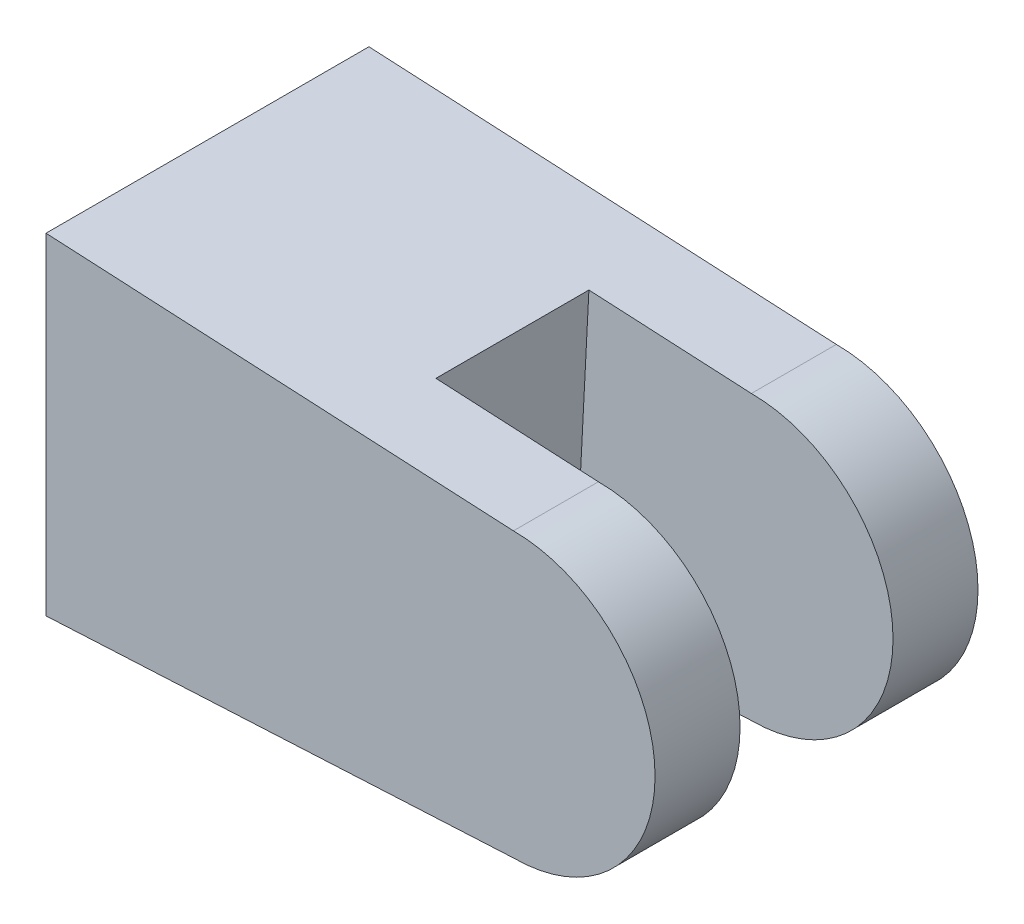
ISO-10303-21;
HEADER;
FILE_DESCRIPTION(('STEP AP214'),'2;1');
FILE_NAME('part.step','',(''),(''),'','','');
FILE_SCHEMA(('AUTOMOTIVE_DESIGN { 1 0 10303 214 1 1 1 1 }'));
ENDSEC;
DATA;
#1=APPLICATION_CONTEXT('core data for automotive mechanical design processes');
#2=APPLICATION_PROTOCOL_DEFINITION('international standard','automotive_design',2000,#1);
#3=PRODUCT_CONTEXT('',#1,'mechanical');
#4=PRODUCT('Part','Part','',(#3));
#5=PRODUCT_RELATED_PRODUCT_CATEGORY('part','',(#4));
#6=PRODUCT_DEFINITION_FORMATION('','',#4);
#7=PRODUCT_DEFINITION_CONTEXT('part definition',#1,'design');
#8=PRODUCT_DEFINITION('design','',#6,#7);
#9=PRODUCT_DEFINITION_SHAPE('','',#8);
#10=(LENGTH_UNIT() NAMED_UNIT(*) SI_UNIT(.MILLI.,.METRE.));
#11=(NAMED_UNIT(*) PLANE_ANGLE_UNIT() SI_UNIT($,.RADIAN.));
#12=(NAMED_UNIT(*) SI_UNIT($,.STERADIAN.) SOLID_ANGLE_UNIT());
#13=UNCERTAINTY_MEASURE_WITH_UNIT(LENGTH_MEASURE(1.E-05),#10,'distance_accuracy_value','');
#14=(GEOMETRIC_REPRESENTATION_CONTEXT(3) GLOBAL_UNCERTAINTY_ASSIGNED_CONTEXT((#13)) GLOBAL_UNIT_ASSIGNED_CONTEXT((#10,
#11,#12)) REPRESENTATION_CONTEXT('',''));
#15=CARTESIAN_POINT('',(0.,0.,0.));
#16=DIRECTION('',(0.,0.,1.));
#17=DIRECTION('',(1.,0.,0.));
#18=AXIS2_PLACEMENT_3D('',#15,#16,#17);
#19=CARTESIAN_POINT('',(0.,0.,57.));
#20=DIRECTION('',(0.,0.,-1.));
#21=DIRECTION('',(-1.,0.,0.));
#22=AXIS2_PLACEMENT_3D('',#19,#20,#21);
#23=CYLINDRICAL_SURFACE('',#22,50.);
#24=CARTESIAN_POINT('',(0.,0.,27.));
#25=DIRECTION('',(0.,0.,1.));
#26=DIRECTION('',(1.,0.,0.));
#27=AXIS2_PLACEMENT_3D('',#24,#25,#26);
#28=CIRCLE('',#27,50.);
#29=CARTESIAN_POINT('',(0.,-50.,27.));
#30=VERTEX_POINT('',#29);
#31=CARTESIAN_POINT('',(0.,50.,27.));
#32=VERTEX_POINT('',#31);
#33=EDGE_CURVE('E127',#30,#32,#28,.T.);
#34=ORIENTED_EDGE('',*,*,#33,.T.);
#35=DIRECTION('',(0.,0.,-1.));
#36=VECTOR('',#35,1.);
#37=CARTESIAN_POINT('',(0.,50.,57.));
#38=LINE('',#37,#36);
#39=CARTESIAN_POINT('',(0.,50.,57.));
#40=VERTEX_POINT('',#39);
#41=EDGE_CURVE('E185',#40,#32,#38,.T.);
#42=ORIENTED_EDGE('',*,*,#41,.F.);
#43=CARTESIAN_POINT('',(0.,0.,57.));
#44=DIRECTION('',(0.,0.,1.));
#45=DIRECTION('',(1.,0.,0.));
#46=AXIS2_PLACEMENT_3D('',#43,#44,#45);
#47=CIRCLE('',#46,50.);
#48=CARTESIAN_POINT('',(0.,-50.,57.));
#49=VERTEX_POINT('',#48);
#50=EDGE_CURVE('E93',#49,#40,#47,.T.);
#51=ORIENTED_EDGE('',*,*,#50,.F.);
#52=DIRECTION('',(0.,0.,-1.));
#53=VECTOR('',#52,1.);
#54=CARTESIAN_POINT('',(0.,-50.,57.));
#55=LINE('',#54,#53);
#56=EDGE_CURVE('E156',#49,#30,#55,.T.);
#57=ORIENTED_EDGE('',*,*,#56,.T.);
#58=EDGE_LOOP('',(#34,#42,#51,#57));
#59=FACE_BOUND('',#58,.T.);
#60=ADVANCED_FACE('F39',(#59),#23,.T.);
#61=CARTESIAN_POINT('',(-165.,-58.5,57.));
#62=DIRECTION('',(-0.0514469315337125,0.998675729772064,0.));
#63=DIRECTION('',(-0.998675729772065,-0.0514469315337125,0.));
#64=AXIS2_PLACEMENT_3D('',#61,#62,#63);
#65=PLANE('',#64);
#66=DIRECTION('',(0.,0.,1.));
#67=VECTOR('',#66,1.);
#68=CARTESIAN_POINT('',(-62.8220369528401,-53.236286752116,57.));
#69=LINE('',#68,#67);
#70=CARTESIAN_POINT('',(-62.8220369528401,-53.236286752116,-27.));
#71=VERTEX_POINT('',#70);
#72=CARTESIAN_POINT('',(-62.8220369528401,-53.236286752116,27.));
#73=VERTEX_POINT('',#72);
#74=EDGE_CURVE('E116',#71,#73,#69,.T.);
#75=ORIENTED_EDGE('',*,*,#74,.T.);
#76=DIRECTION('',(0.998675729772065,0.0514469315337125,0.));
#77=VECTOR('',#76,1.);
#78=CARTESIAN_POINT('',(-165.,-58.5,27.));
#79=LINE('',#78,#77);
#80=EDGE_CURVE('E144',#73,#30,#79,.T.);
#81=ORIENTED_EDGE('',*,*,#80,.T.);
#82=ORIENTED_EDGE('',*,*,#56,.F.);
#83=DIRECTION('',(0.998675729772065,0.0514469315337125,0.));
#84=VECTOR('',#83,1.);
#85=CARTESIAN_POINT('',(-165.,-58.5,57.));
#86=LINE('',#85,#84);
#87=CARTESIAN_POINT('',(-165.,-58.5,57.));
#88=VERTEX_POINT('',#87);
#89=EDGE_CURVE('E157',#88,#49,#86,.T.);
#90=ORIENTED_EDGE('',*,*,#89,.F.);
#91=DIRECTION('',(0.,0.,-1.));
#92=VECTOR('',#91,1.);
#93=CARTESIAN_POINT('',(-165.,-58.5,57.));
#94=LINE('',#93,#92);
#95=CARTESIAN_POINT('',(-165.,-58.5,-57.));
#96=VERTEX_POINT('',#95);
#97=EDGE_CURVE('E167',#88,#96,#94,.T.);
#98=ORIENTED_EDGE('',*,*,#97,.T.);
#99=DIRECTION('',(0.998675729772065,0.0514469315337125,0.));
#100=VECTOR('',#99,1.);
#101=CARTESIAN_POINT('',(-165.,-58.5,-57.));
#102=LINE('',#101,#100);
#103=CARTESIAN_POINT('',(0.,-50.,-57.));
#104=VERTEX_POINT('',#103);
#105=EDGE_CURVE('E151',#96,#104,#102,.T.);
#106=ORIENTED_EDGE('',*,*,#105,.T.);
#107=CARTESIAN_POINT('',(0.,-50.,-27.));
#108=VERTEX_POINT('',#107);
#109=EDGE_CURVE('E136',#108,#104,#55,.T.);
#110=ORIENTED_EDGE('',*,*,#109,.F.);
#111=DIRECTION('',(-0.998675729772065,-0.0514469315337125,0.));
#112=VECTOR('',#111,1.);
#113=CARTESIAN_POINT('',(-165.,-58.5,-27.));
#114=LINE('',#113,#112);
#115=EDGE_CURVE('E128',#108,#71,#114,.T.);
#116=ORIENTED_EDGE('',*,*,#115,.T.);
#117=EDGE_LOOP('',(#75,#81,#82,#90,#98,#106,#110,#116));
#118=FACE_BOUND('',#117,.T.);
#119=ADVANCED_FACE('F41',(#118),#65,.F.);
#120=CARTESIAN_POINT('',(0.,50.,-27.));
#121=VERTEX_POINT('',#120);
#122=CARTESIAN_POINT('',(0.,50.,-57.));
#123=VERTEX_POINT('',#122);
#124=EDGE_CURVE('E184',#121,#123,#38,.T.);
#125=ORIENTED_EDGE('',*,*,#124,.F.);
#126=CARTESIAN_POINT('',(0.,0.,-27.));
#127=DIRECTION('',(0.,0.,-1.));
#128=DIRECTION('',(-1.,0.,0.));
#129=AXIS2_PLACEMENT_3D('',#126,#127,#128);
#130=CIRCLE('',#129,50.);
#131=EDGE_CURVE('E55',#121,#108,#130,.T.);
#132=ORIENTED_EDGE('',*,*,#131,.T.);
#133=ORIENTED_EDGE('',*,*,#109,.T.);
#134=CARTESIAN_POINT('',(0.,0.,-57.));
#135=DIRECTION('',(0.,0.,1.));
#136=DIRECTION('',(1.,0.,0.));
#137=AXIS2_PLACEMENT_3D('',#134,#135,#136);
#138=CIRCLE('',#137,50.);
#139=EDGE_CURVE('E170',#104,#123,#138,.T.);
#140=ORIENTED_EDGE('',*,*,#139,.T.);
#141=EDGE_LOOP('',(#125,#132,#133,#140));
#142=FACE_BOUND('',#141,.T.);
#143=ADVANCED_FACE('F212',(#142),#23,.T.);
#144=CARTESIAN_POINT('',(-165.,58.5,57.));
#145=DIRECTION('',(-0.0514469315337123,-0.998675729772064,0.));
#146=DIRECTION('',(0.998675729772065,-0.0514469315337123,0.));
#147=AXIS2_PLACEMENT_3D('',#144,#145,#146);
#148=PLANE('',#147);
#149=ORIENTED_EDGE('',*,*,#41,.T.);
#150=DIRECTION('',(-0.998675729772065,0.0514469315337123,0.));
#151=VECTOR('',#150,1.);
#152=CARTESIAN_POINT('',(-165.,58.5,27.));
#153=LINE('',#152,#151);
#154=CARTESIAN_POINT('',(-57.3516036916257,52.954476553811,27.));
#155=VERTEX_POINT('',#154);
#156=EDGE_CURVE('E11',#32,#155,#153,.T.);
#157=ORIENTED_EDGE('',*,*,#156,.T.);
#158=DIRECTION('',(0.,0.,-1.));
#159=VECTOR('',#158,1.);
#160=CARTESIAN_POINT('',(-57.3516036916257,52.954476553811,57.));
#161=LINE('',#160,#159);
#162=CARTESIAN_POINT('',(-57.3516036916257,52.954476553811,-27.));
#163=VERTEX_POINT('',#162);
#164=EDGE_CURVE('E48',#155,#163,#161,.T.);
#165=ORIENTED_EDGE('',*,*,#164,.T.);
#166=DIRECTION('',(0.998675729772065,-0.0514469315337123,0.));
#167=VECTOR('',#166,1.);
#168=CARTESIAN_POINT('',(-165.,58.5,-27.));
#169=LINE('',#168,#167);
#170=EDGE_CURVE('E131',#163,#121,#169,.T.);
#171=ORIENTED_EDGE('',*,*,#170,.T.);
#172=ORIENTED_EDGE('',*,*,#124,.T.);
#173=DIRECTION('',(-0.998675729772065,0.0514469315337123,0.));
#174=VECTOR('',#173,1.);
#175=CARTESIAN_POINT('',(-165.,58.5,-57.));
#176=LINE('',#175,#174);
#177=CARTESIAN_POINT('',(-165.,58.5,-57.));
#178=VERTEX_POINT('',#177);
#179=EDGE_CURVE('E174',#123,#178,#176,.T.);
#180=ORIENTED_EDGE('',*,*,#179,.T.);
#181=DIRECTION('',(0.,0.,-1.));
#182=VECTOR('',#181,1.);
#183=CARTESIAN_POINT('',(-165.,58.5,57.));
#184=LINE('',#183,#182);
#185=CARTESIAN_POINT('',(-165.,58.5,57.));
#186=VERTEX_POINT('',#185);
#187=EDGE_CURVE('E181',#186,#178,#184,.T.);
#188=ORIENTED_EDGE('',*,*,#187,.F.);
#189=DIRECTION('',(-0.998675729772065,0.0514469315337123,0.));
#190=VECTOR('',#189,1.);
#191=CARTESIAN_POINT('',(-165.,58.5,57.));
#192=LINE('',#191,#190);
#193=EDGE_CURVE('E162',#40,#186,#192,.T.);
#194=ORIENTED_EDGE('',*,*,#193,.F.);
#195=EDGE_LOOP('',(#149,#157,#165,#171,#172,#180,#188,#194));
#196=FACE_BOUND('',#195,.T.);
#197=ADVANCED_FACE('F194',(#196),#148,.F.);
#198=CARTESIAN_POINT('',(-165.,-58.5,57.));
#199=DIRECTION('',(1.,0.,0.));
#200=DIRECTION('',(0.,0.,-1.));
#201=AXIS2_PLACEMENT_3D('',#198,#199,#200);
#202=PLANE('',#201);
#203=CARTESIAN_POINT('',(-165.,0.,0.));
#204=DIRECTION('',(-1.,0.,0.));
#205=DIRECTION('',(0.,0.,1.));
#206=AXIS2_PLACEMENT_3D('',#203,#204,#205);
#207=CIRCLE('',#206,37.5);
#208=CARTESIAN_POINT('',(-165.,0.,37.5));
#209=VERTEX_POINT('',#208);
#210=EDGE_CURVE('E152',#209,#209,#207,.T.);
#211=ORIENTED_EDGE('',*,*,#210,.F.);
#212=EDGE_LOOP('',(#211));
#213=FACE_BOUND('',#212,.T.);
#214=DIRECTION('',(0.,-1.,0.));
#215=VECTOR('',#214,1.);
#216=CARTESIAN_POINT('',(-165.,-58.5,-57.));
#217=LINE('',#216,#215);
#218=EDGE_CURVE('E85',#178,#96,#217,.T.);
#219=ORIENTED_EDGE('',*,*,#218,.T.);
#220=ORIENTED_EDGE('',*,*,#97,.F.);
#221=DIRECTION('',(0.,-1.,0.));
#222=VECTOR('',#221,1.);
#223=CARTESIAN_POINT('',(-165.,-58.5,57.));
#224=LINE('',#223,#222);
#225=EDGE_CURVE('E64',#186,#88,#224,.T.);
#226=ORIENTED_EDGE('',*,*,#225,.F.);
#227=ORIENTED_EDGE('',*,*,#187,.T.);
#228=EDGE_LOOP('',(#219,#220,#226,#227));
#229=FACE_BOUND('',#228,.T.);
#230=ADVANCED_FACE('F215',(#213,#229),#202,.F.);
#231=CARTESIAN_POINT('',(0.,0.,57.));
#232=DIRECTION('',(0.,0.,1.));
#233=DIRECTION('',(1.,0.,0.));
#234=AXIS2_PLACEMENT_3D('',#231,#232,#233);
#235=PLANE('',#234);
#236=ORIENTED_EDGE('',*,*,#89,.T.);
#237=ORIENTED_EDGE('',*,*,#50,.T.);
#238=ORIENTED_EDGE('',*,*,#193,.T.);
#239=ORIENTED_EDGE('',*,*,#225,.T.);
#240=EDGE_LOOP('',(#236,#237,#238,#239));
#241=FACE_BOUND('',#240,.T.);
#242=ADVANCED_FACE('F205',(#241),#235,.T.);
#243=CARTESIAN_POINT('',(0.,0.,-57.));
#244=DIRECTION('',(0.,0.,1.));
#245=DIRECTION('',(1.,0.,0.));
#246=AXIS2_PLACEMENT_3D('',#243,#244,#245);
#247=PLANE('',#246);
#248=ORIENTED_EDGE('',*,*,#105,.F.);
#249=ORIENTED_EDGE('',*,*,#218,.F.);
#250=ORIENTED_EDGE('',*,*,#179,.F.);
#251=ORIENTED_EDGE('',*,*,#139,.F.);
#252=EDGE_LOOP('',(#248,#249,#250,#251));
#253=FACE_BOUND('',#252,.T.);
#254=ADVANCED_FACE('F209',(#253),#247,.F.);
#255=CARTESIAN_POINT('',(-167.,0.,0.));
#256=DIRECTION('',(1.,0.,0.));
#257=DIRECTION('',(0.,0.,-1.));
#258=AXIS2_PLACEMENT_3D('',#255,#256,#257);
#259=CYLINDRICAL_SURFACE('',#258,37.5);
#260=CARTESIAN_POINT('',(-167.,0.,0.));
#261=DIRECTION('',(-1.,0.,0.));
#262=DIRECTION('',(0.,0.,1.));
#263=AXIS2_PLACEMENT_3D('',#260,#261,#262);
#264=CIRCLE('',#263,37.5);
#265=CARTESIAN_POINT('',(-167.,0.,37.5));
#266=VERTEX_POINT('',#265);
#267=EDGE_CURVE('E147',#266,#266,#264,.T.);
#268=ORIENTED_EDGE('',*,*,#267,.F.);
#269=EDGE_LOOP('',(#268));
#270=FACE_BOUND('',#269,.T.);
#271=ORIENTED_EDGE('',*,*,#210,.T.);
#272=EDGE_LOOP('',(#271));
#273=FACE_BOUND('',#272,.T.);
#274=ADVANCED_FACE('F274',(#270,#273),#259,.T.);
#275=CARTESIAN_POINT('',(-167.,0.,0.));
#276=DIRECTION('',(-1.,0.,0.));
#277=DIRECTION('',(0.,0.,1.));
#278=AXIS2_PLACEMENT_3D('',#275,#276,#277);
#279=PLANE('',#278);
#280=ORIENTED_EDGE('',*,*,#267,.T.);
#281=EDGE_LOOP('',(#280));
#282=FACE_BOUND('',#281,.T.);
#283=ADVANCED_FACE('F250',(#282),#279,.T.);
#284=CARTESIAN_POINT('',(46.4861131881792,-69.4977694672698,27.));
#285=DIRECTION('',(0.,0.,1.));
#286=DIRECTION('',(1.,0.,0.));
#287=AXIS2_PLACEMENT_3D('',#284,#285,#286);
#288=PLANE('',#287);
#289=DIRECTION('',(0.0514469315337123,0.998675729772064,0.));
#290=VECTOR('',#289,1.);
#291=CARTESIAN_POINT('',(-63.3682170867479,-63.8386069985615,27.));
#292=LINE('',#291,#290);
#293=EDGE_CURVE('E122',#73,#155,#292,.T.);
#294=ORIENTED_EDGE('',*,*,#293,.T.);
#295=ORIENTED_EDGE('',*,*,#156,.F.);
#296=ORIENTED_EDGE('',*,*,#33,.F.);
#297=ORIENTED_EDGE('',*,*,#80,.F.);
#298=EDGE_LOOP('',(#294,#295,#296,#297));
#299=FACE_BOUND('',#298,.T.);
#300=ADVANCED_FACE('F198',(#299),#288,.F.);
#301=CARTESIAN_POINT('',(-63.3682170867479,-63.8386069985615,-27.));
#302=DIRECTION('',(-0.998675729772064,0.0514469315337123,0.));
#303=DIRECTION('',(-0.0514469315337123,-0.998675729772065,0.));
#304=AXIS2_PLACEMENT_3D('',#301,#302,#303);
#305=PLANE('',#304);
#306=DIRECTION('',(0.0514469315337123,0.998675729772064,0.));
#307=VECTOR('',#306,1.);
#308=CARTESIAN_POINT('',(-63.3682170867479,-63.8386069985615,-27.));
#309=LINE('',#308,#307);
#310=EDGE_CURVE('E119',#71,#163,#309,.T.);
#311=ORIENTED_EDGE('',*,*,#310,.T.);
#312=ORIENTED_EDGE('',*,*,#164,.F.);
#313=ORIENTED_EDGE('',*,*,#293,.F.);
#314=ORIENTED_EDGE('',*,*,#74,.F.);
#315=EDGE_LOOP('',(#311,#312,#313,#314));
#316=FACE_BOUND('',#315,.T.);
#317=ADVANCED_FACE('F118',(#316),#305,.F.);
#318=CARTESIAN_POINT('',(46.4861131881792,-69.4977694672698,-27.));
#319=DIRECTION('',(0.,0.,-1.));
#320=DIRECTION('',(-1.,0.,0.));
#321=AXIS2_PLACEMENT_3D('',#318,#319,#320);
#322=PLANE('',#321);
#323=ORIENTED_EDGE('',*,*,#131,.F.);
#324=ORIENTED_EDGE('',*,*,#170,.F.);
#325=ORIENTED_EDGE('',*,*,#310,.F.);
#326=ORIENTED_EDGE('',*,*,#115,.F.);
#327=EDGE_LOOP('',(#323,#324,#325,#326));
#328=FACE_BOUND('',#327,.T.);
#329=ADVANCED_FACE('F130',(#328),#322,.F.);
#330=CLOSED_SHELL('',(#60,#119,#143,#197,#230,#242,#254,#274,#283,#300,#317,#329));
#331=MANIFOLD_SOLID_BREP('B2',#330);
#332=ADVANCED_BREP_SHAPE_REPRESENTATION('',(#18,#331),#14);
#333=SHAPE_DEFINITION_REPRESENTATION(#9,#332);
ENDSEC;
END-ISO-10303-21;
